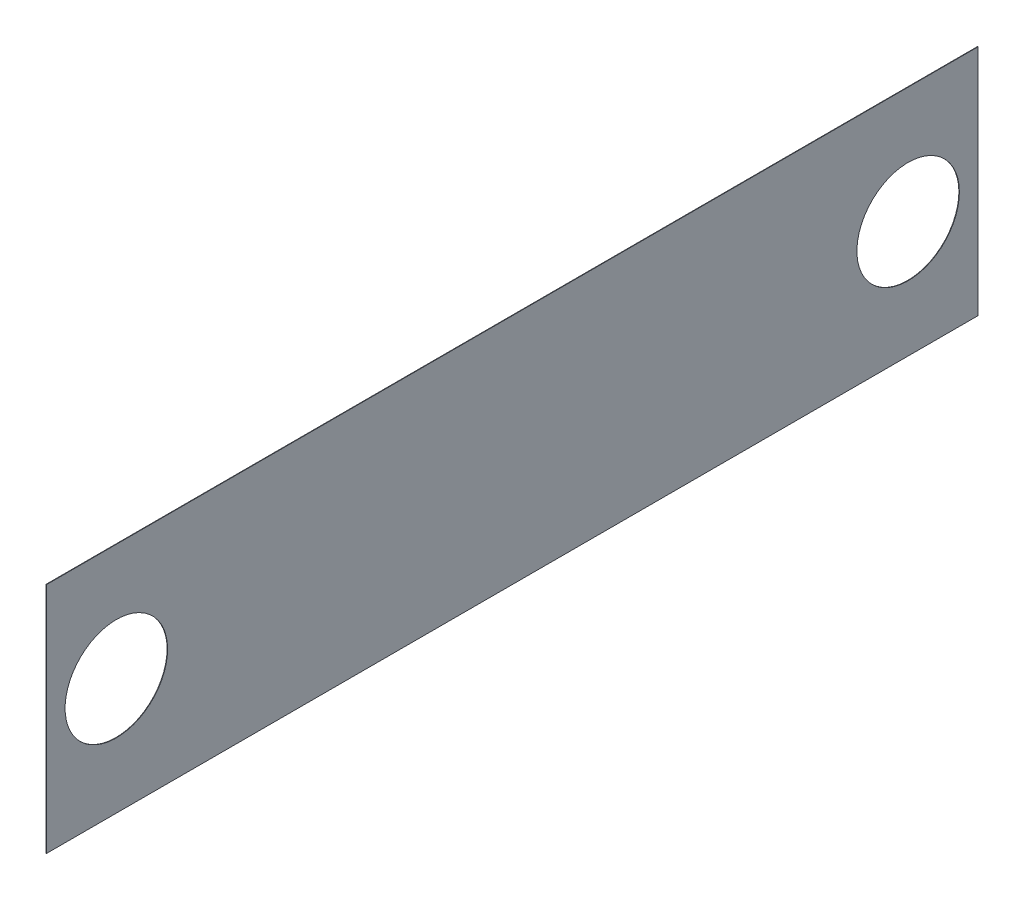
ISO-10303-21;
HEADER;
FILE_DESCRIPTION(('STEP AP214'),'2;1');
FILE_NAME('part.step','',(''),(''),'','','');
FILE_SCHEMA(('AUTOMOTIVE_DESIGN { 1 0 10303 214 1 1 1 1 }'));
ENDSEC;
DATA;
#1=APPLICATION_CONTEXT('core data for automotive mechanical design processes');
#2=APPLICATION_PROTOCOL_DEFINITION('international standard','automotive_design',2000,#1);
#3=PRODUCT_CONTEXT('',#1,'mechanical');
#4=PRODUCT('Part','Part','',(#3));
#5=PRODUCT_RELATED_PRODUCT_CATEGORY('part','',(#4));
#6=PRODUCT_DEFINITION_FORMATION('','',#4);
#7=PRODUCT_DEFINITION_CONTEXT('part definition',#1,'design');
#8=PRODUCT_DEFINITION('design','',#6,#7);
#9=PRODUCT_DEFINITION_SHAPE('','',#8);
#10=(LENGTH_UNIT() NAMED_UNIT(*) SI_UNIT(.MILLI.,.METRE.));
#11=(NAMED_UNIT(*) PLANE_ANGLE_UNIT() SI_UNIT($,.RADIAN.));
#12=(NAMED_UNIT(*) SI_UNIT($,.STERADIAN.) SOLID_ANGLE_UNIT());
#13=UNCERTAINTY_MEASURE_WITH_UNIT(LENGTH_MEASURE(1.E-05),#10,'distance_accuracy_value','');
#14=(GEOMETRIC_REPRESENTATION_CONTEXT(3) GLOBAL_UNCERTAINTY_ASSIGNED_CONTEXT((#13)) GLOBAL_UNIT_ASSIGNED_CONTEXT((#10,
#11,#12)) REPRESENTATION_CONTEXT('',''));
#15=CARTESIAN_POINT('',(0.,0.,0.));
#16=DIRECTION('',(0.,0.,1.));
#17=DIRECTION('',(1.,0.,0.));
#18=AXIS2_PLACEMENT_3D('',#15,#16,#17);
#19=CARTESIAN_POINT('',(0.0508,12.5,50.));
#20=DIRECTION('',(0.,0.,-1.));
#21=DIRECTION('',(-1.,0.,0.));
#22=AXIS2_PLACEMENT_3D('',#19,#20,#21);
#23=PLANE('',#22);
#24=DIRECTION('',(0.,-1.,0.));
#25=VECTOR('',#24,1.);
#26=CARTESIAN_POINT('',(0.,12.5,50.));
#27=LINE('',#26,#25);
#28=CARTESIAN_POINT('',(0.,12.5,50.));
#29=VERTEX_POINT('',#28);
#30=CARTESIAN_POINT('',(0.,-12.5,50.));
#31=VERTEX_POINT('',#30);
#32=EDGE_CURVE('E97',#29,#31,#27,.T.);
#33=ORIENTED_EDGE('',*,*,#32,.T.);
#34=DIRECTION('',(-1.,0.,0.));
#35=VECTOR('',#34,1.);
#36=CARTESIAN_POINT('',(0.0508,-12.5,50.));
#37=LINE('',#36,#35);
#38=CARTESIAN_POINT('',(0.0508,-12.5,50.));
#39=VERTEX_POINT('',#38);
#40=EDGE_CURVE('E11',#39,#31,#37,.T.);
#41=ORIENTED_EDGE('',*,*,#40,.F.);
#42=DIRECTION('',(0.,-1.,0.));
#43=VECTOR('',#42,1.);
#44=CARTESIAN_POINT('',(0.0508,12.5,50.));
#45=LINE('',#44,#43);
#46=CARTESIAN_POINT('',(0.0508,12.5,50.));
#47=VERTEX_POINT('',#46);
#48=EDGE_CURVE('E85',#47,#39,#45,.T.);
#49=ORIENTED_EDGE('',*,*,#48,.F.);
#50=DIRECTION('',(-1.,0.,0.));
#51=VECTOR('',#50,1.);
#52=CARTESIAN_POINT('',(0.0508,12.5,50.));
#53=LINE('',#52,#51);
#54=EDGE_CURVE('E93',#47,#29,#53,.T.);
#55=ORIENTED_EDGE('',*,*,#54,.T.);
#56=EDGE_LOOP('',(#33,#41,#49,#55));
#57=FACE_BOUND('',#56,.T.);
#58=ADVANCED_FACE('F34',(#57),#23,.F.);
#59=CARTESIAN_POINT('',(0.0508,-12.5,50.));
#60=DIRECTION('',(0.,1.,0.));
#61=DIRECTION('',(0.,0.,1.));
#62=AXIS2_PLACEMENT_3D('',#59,#60,#61);
#63=PLANE('',#62);
#64=DIRECTION('',(0.,0.,-1.));
#65=VECTOR('',#64,1.);
#66=CARTESIAN_POINT('',(0.,-12.5,50.));
#67=LINE('',#66,#65);
#68=CARTESIAN_POINT('',(0.,-12.5,-50.));
#69=VERTEX_POINT('',#68);
#70=EDGE_CURVE('E89',#31,#69,#67,.T.);
#71=ORIENTED_EDGE('',*,*,#70,.T.);
#72=DIRECTION('',(-1.,0.,0.));
#73=VECTOR('',#72,1.);
#74=CARTESIAN_POINT('',(0.0508,-12.5,-50.));
#75=LINE('',#74,#73);
#76=CARTESIAN_POINT('',(0.0508,-12.5,-50.));
#77=VERTEX_POINT('',#76);
#78=EDGE_CURVE('E42',#77,#69,#75,.T.);
#79=ORIENTED_EDGE('',*,*,#78,.F.);
#80=DIRECTION('',(0.,0.,-1.));
#81=VECTOR('',#80,1.);
#82=CARTESIAN_POINT('',(0.0508,-12.5,50.));
#83=LINE('',#82,#81);
#84=EDGE_CURVE('E80',#39,#77,#83,.T.);
#85=ORIENTED_EDGE('',*,*,#84,.F.);
#86=ORIENTED_EDGE('',*,*,#40,.T.);
#87=EDGE_LOOP('',(#71,#79,#85,#86));
#88=FACE_BOUND('',#87,.T.);
#89=ADVANCED_FACE('F88',(#88),#63,.F.);
#90=CARTESIAN_POINT('',(0.0508,12.5,-50.));
#91=DIRECTION('',(0.,0.,1.));
#92=DIRECTION('',(1.,0.,0.));
#93=AXIS2_PLACEMENT_3D('',#90,#91,#92);
#94=PLANE('',#93);
#95=DIRECTION('',(0.,1.,0.));
#96=VECTOR('',#95,1.);
#97=CARTESIAN_POINT('',(0.,12.5,-50.));
#98=LINE('',#97,#96);
#99=CARTESIAN_POINT('',(0.,12.5,-50.));
#100=VERTEX_POINT('',#99);
#101=EDGE_CURVE('E67',#69,#100,#98,.T.);
#102=ORIENTED_EDGE('',*,*,#101,.T.);
#103=DIRECTION('',(-1.,0.,0.));
#104=VECTOR('',#103,1.);
#105=CARTESIAN_POINT('',(0.0508,12.5,-50.));
#106=LINE('',#105,#104);
#107=CARTESIAN_POINT('',(0.0508,12.5,-50.));
#108=VERTEX_POINT('',#107);
#109=EDGE_CURVE('E90',#108,#100,#106,.T.);
#110=ORIENTED_EDGE('',*,*,#109,.F.);
#111=DIRECTION('',(0.,1.,0.));
#112=VECTOR('',#111,1.);
#113=CARTESIAN_POINT('',(0.0508,12.5,-50.));
#114=LINE('',#113,#112);
#115=EDGE_CURVE('E83',#77,#108,#114,.T.);
#116=ORIENTED_EDGE('',*,*,#115,.F.);
#117=ORIENTED_EDGE('',*,*,#78,.T.);
#118=EDGE_LOOP('',(#102,#110,#116,#117));
#119=FACE_BOUND('',#118,.T.);
#120=ADVANCED_FACE('F91',(#119),#94,.F.);
#121=CARTESIAN_POINT('',(0.0508,12.5,50.));
#122=DIRECTION('',(0.,-1.,0.));
#123=DIRECTION('',(0.,0.,-1.));
#124=AXIS2_PLACEMENT_3D('',#121,#122,#123);
#125=PLANE('',#124);
#126=DIRECTION('',(0.,0.,1.));
#127=VECTOR('',#126,1.);
#128=CARTESIAN_POINT('',(0.,12.5,50.));
#129=LINE('',#128,#127);
#130=EDGE_CURVE('E73',#100,#29,#129,.T.);
#131=ORIENTED_EDGE('',*,*,#130,.T.);
#132=ORIENTED_EDGE('',*,*,#54,.F.);
#133=DIRECTION('',(0.,0.,1.));
#134=VECTOR('',#133,1.);
#135=CARTESIAN_POINT('',(0.0508,12.5,50.));
#136=LINE('',#135,#134);
#137=EDGE_CURVE('E50',#108,#47,#136,.T.);
#138=ORIENTED_EDGE('',*,*,#137,.F.);
#139=ORIENTED_EDGE('',*,*,#109,.T.);
#140=EDGE_LOOP('',(#131,#132,#138,#139));
#141=FACE_BOUND('',#140,.T.);
#142=ADVANCED_FACE('F105',(#141),#125,.F.);
#143=CARTESIAN_POINT('',(0.0508,0.,0.));
#144=DIRECTION('',(1.,0.,0.));
#145=DIRECTION('',(0.,0.,-1.));
#146=AXIS2_PLACEMENT_3D('',#143,#144,#145);
#147=PLANE('',#146);
#148=CARTESIAN_POINT('',(0.0508000000000007,0.,42.5));
#149=DIRECTION('',(1.,0.,0.));
#150=DIRECTION('',(0.,0.,-1.));
#151=AXIS2_PLACEMENT_3D('',#148,#149,#150);
#152=CIRCLE('',#151,5.5);
#153=CARTESIAN_POINT('',(0.0508000000000007,0.,37.));
#154=VERTEX_POINT('',#153);
#155=EDGE_CURVE('E119',#154,#154,#152,.T.);
#156=ORIENTED_EDGE('',*,*,#155,.F.);
#157=EDGE_LOOP('',(#156));
#158=FACE_BOUND('',#157,.T.);
#159=CARTESIAN_POINT('',(0.0508000000000007,0.,-42.5));
#160=DIRECTION('',(1.,0.,0.));
#161=DIRECTION('',(0.,0.,-1.));
#162=AXIS2_PLACEMENT_3D('',#159,#160,#161);
#163=CIRCLE('',#162,5.5);
#164=CARTESIAN_POINT('',(0.0508000000000007,0.,-48.));
#165=VERTEX_POINT('',#164);
#166=EDGE_CURVE('E113',#165,#165,#163,.T.);
#167=ORIENTED_EDGE('',*,*,#166,.F.);
#168=EDGE_LOOP('',(#167));
#169=FACE_BOUND('',#168,.T.);
#170=ORIENTED_EDGE('',*,*,#48,.T.);
#171=ORIENTED_EDGE('',*,*,#84,.T.);
#172=ORIENTED_EDGE('',*,*,#115,.T.);
#173=ORIENTED_EDGE('',*,*,#137,.T.);
#174=EDGE_LOOP('',(#170,#171,#172,#173));
#175=FACE_BOUND('',#174,.T.);
#176=ADVANCED_FACE('F81',(#158,#169,#175),#147,.T.);
#177=CARTESIAN_POINT('',(0.,0.,0.));
#178=DIRECTION('',(1.,0.,0.));
#179=DIRECTION('',(0.,0.,-1.));
#180=AXIS2_PLACEMENT_3D('',#177,#178,#179);
#181=PLANE('',#180);
#182=CARTESIAN_POINT('',(0.,0.,42.5));
#183=DIRECTION('',(1.,0.,0.));
#184=DIRECTION('',(0.,0.,-1.));
#185=AXIS2_PLACEMENT_3D('',#182,#183,#184);
#186=CIRCLE('',#185,5.5);
#187=CARTESIAN_POINT('',(0.,0.,37.));
#188=VERTEX_POINT('',#187);
#189=EDGE_CURVE('E116',#188,#188,#186,.T.);
#190=ORIENTED_EDGE('',*,*,#189,.T.);
#191=EDGE_LOOP('',(#190));
#192=FACE_BOUND('',#191,.T.);
#193=CARTESIAN_POINT('',(0.,0.,-42.5));
#194=DIRECTION('',(1.,0.,0.));
#195=DIRECTION('',(0.,0.,-1.));
#196=AXIS2_PLACEMENT_3D('',#193,#194,#195);
#197=CIRCLE('',#196,5.5);
#198=CARTESIAN_POINT('',(0.,0.,-48.));
#199=VERTEX_POINT('',#198);
#200=EDGE_CURVE('E100',#199,#199,#197,.T.);
#201=ORIENTED_EDGE('',*,*,#200,.T.);
#202=EDGE_LOOP('',(#201));
#203=FACE_BOUND('',#202,.T.);
#204=ORIENTED_EDGE('',*,*,#32,.F.);
#205=ORIENTED_EDGE('',*,*,#130,.F.);
#206=ORIENTED_EDGE('',*,*,#101,.F.);
#207=ORIENTED_EDGE('',*,*,#70,.F.);
#208=EDGE_LOOP('',(#204,#205,#206,#207));
#209=FACE_BOUND('',#208,.T.);
#210=ADVANCED_FACE('F108',(#192,#203,#209),#181,.F.);
#211=CARTESIAN_POINT('',(0.0508,0.,-42.5));
#212=DIRECTION('',(1.,0.,0.));
#213=DIRECTION('',(0.,0.,-1.));
#214=AXIS2_PLACEMENT_3D('',#211,#212,#213);
#215=CYLINDRICAL_SURFACE('',#214,5.5);
#216=ORIENTED_EDGE('',*,*,#200,.F.);
#217=EDGE_LOOP('',(#216));
#218=FACE_BOUND('',#217,.T.);
#219=ORIENTED_EDGE('',*,*,#166,.T.);
#220=EDGE_LOOP('',(#219));
#221=FACE_BOUND('',#220,.T.);
#222=ADVANCED_FACE('F130',(#218,#221),#215,.F.);
#223=CARTESIAN_POINT('',(0.0508,0.,42.5));
#224=DIRECTION('',(1.,0.,0.));
#225=DIRECTION('',(0.,0.,-1.));
#226=AXIS2_PLACEMENT_3D('',#223,#224,#225);
#227=CYLINDRICAL_SURFACE('',#226,5.5);
#228=ORIENTED_EDGE('',*,*,#189,.F.);
#229=EDGE_LOOP('',(#228));
#230=FACE_BOUND('',#229,.T.);
#231=ORIENTED_EDGE('',*,*,#155,.T.);
#232=EDGE_LOOP('',(#231));
#233=FACE_BOUND('',#232,.T.);
#234=ADVANCED_FACE('F123',(#230,#233),#227,.F.);
#235=CLOSED_SHELL('',(#58,#89,#120,#142,#176,#210,#222,#234));
#236=MANIFOLD_SOLID_BREP('B2',#235);
#237=ADVANCED_BREP_SHAPE_REPRESENTATION('',(#18,#236),#14);
#238=SHAPE_DEFINITION_REPRESENTATION(#9,#237);
ENDSEC;
END-ISO-10303-21;
